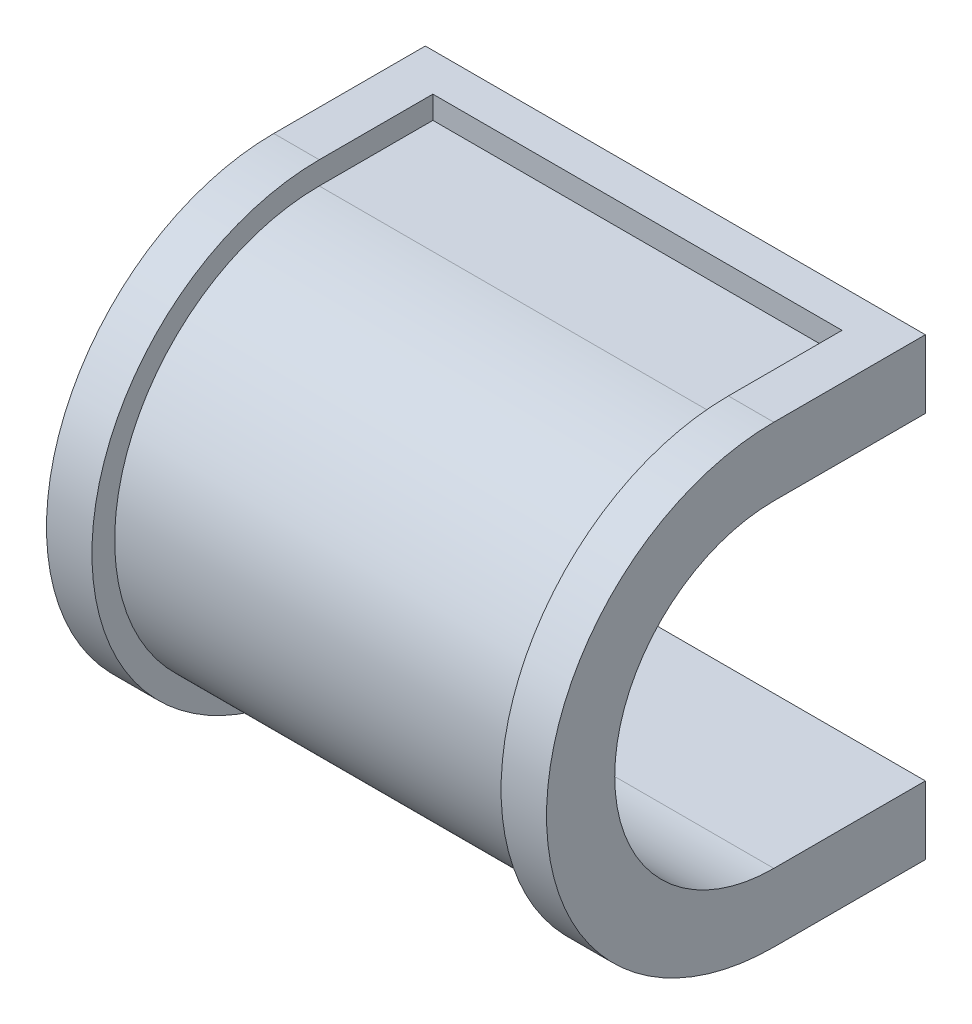
ISO-10303-21;
HEADER;
FILE_DESCRIPTION(('STEP AP214'),'2;1');
FILE_NAME('part.step','',(''),(''),'','','');
FILE_SCHEMA(('AUTOMOTIVE_DESIGN { 1 0 10303 214 1 1 1 1 }'));
ENDSEC;
DATA;
#1=APPLICATION_CONTEXT('core data for automotive mechanical design processes');
#2=APPLICATION_PROTOCOL_DEFINITION('international standard','automotive_design',2000,#1);
#3=PRODUCT_CONTEXT('',#1,'mechanical');
#4=PRODUCT('Part','Part','',(#3));
#5=PRODUCT_RELATED_PRODUCT_CATEGORY('part','',(#4));
#6=PRODUCT_DEFINITION_FORMATION('','',#4);
#7=PRODUCT_DEFINITION_CONTEXT('part definition',#1,'design');
#8=PRODUCT_DEFINITION('design','',#6,#7);
#9=PRODUCT_DEFINITION_SHAPE('','',#8);
#10=(LENGTH_UNIT() NAMED_UNIT(*) SI_UNIT(.MILLI.,.METRE.));
#11=(NAMED_UNIT(*) PLANE_ANGLE_UNIT() SI_UNIT($,.RADIAN.));
#12=(NAMED_UNIT(*) SI_UNIT($,.STERADIAN.) SOLID_ANGLE_UNIT());
#13=UNCERTAINTY_MEASURE_WITH_UNIT(LENGTH_MEASURE(1.E-05),#10,'distance_accuracy_value','');
#14=(GEOMETRIC_REPRESENTATION_CONTEXT(3) GLOBAL_UNCERTAINTY_ASSIGNED_CONTEXT((#13)) GLOBAL_UNIT_ASSIGNED_CONTEXT((#10,
#11,#12)) REPRESENTATION_CONTEXT('',''));
#15=CARTESIAN_POINT('',(0.,0.,0.));
#16=DIRECTION('',(0.,0.,1.));
#17=DIRECTION('',(1.,0.,0.));
#18=AXIS2_PLACEMENT_3D('',#15,#16,#17);
#19=CARTESIAN_POINT('',(66.,54.,-20.));
#20=DIRECTION('',(0.,0.,1.));
#21=DIRECTION('',(1.,0.,0.));
#22=AXIS2_PLACEMENT_3D('',#19,#20,#21);
#23=PLANE('',#22);
#24=DIRECTION('',(0.,1.,0.));
#25=VECTOR('',#24,1.);
#26=CARTESIAN_POINT('',(0.,54.,-20.));
#27=LINE('',#26,#25);
#28=CARTESIAN_POINT('',(0.,-3.,-20.));
#29=VERTEX_POINT('',#28);
#30=CARTESIAN_POINT('',(0.,6.,-20.));
#31=VERTEX_POINT('',#30);
#32=EDGE_CURVE('E304',#29,#31,#27,.T.);
#33=ORIENTED_EDGE('',*,*,#32,.T.);
#34=DIRECTION('',(1.,0.,0.));
#35=VECTOR('',#34,1.);
#36=CARTESIAN_POINT('',(0.,6.,-20.));
#37=LINE('',#36,#35);
#38=CARTESIAN_POINT('',(66.,6.,-20.));
#39=VERTEX_POINT('',#38);
#40=EDGE_CURVE('E275',#31,#39,#37,.T.);
#41=ORIENTED_EDGE('',*,*,#40,.T.);
#42=DIRECTION('',(0.,1.,0.));
#43=VECTOR('',#42,1.);
#44=CARTESIAN_POINT('',(66.,0.,-20.));
#45=LINE('',#44,#43);
#46=CARTESIAN_POINT('',(66.,-3.,-20.));
#47=VERTEX_POINT('',#46);
#48=EDGE_CURVE('E293',#47,#39,#45,.T.);
#49=ORIENTED_EDGE('',*,*,#48,.F.);
#50=DIRECTION('',(-1.,0.,0.));
#51=VECTOR('',#50,1.);
#52=CARTESIAN_POINT('',(66.,-3.,-20.));
#53=LINE('',#52,#51);
#54=EDGE_CURVE('E323',#47,#29,#53,.T.);
#55=ORIENTED_EDGE('',*,*,#54,.T.);
#56=EDGE_LOOP('',(#33,#41,#49,#55));
#57=FACE_BOUND('',#56,.T.);
#58=ADVANCED_FACE('F45',(#57),#23,.F.);
#59=CARTESIAN_POINT('',(66.,27.,0.));
#60=DIRECTION('',(-1.,0.,0.));
#61=DIRECTION('',(0.,0.,1.));
#62=AXIS2_PLACEMENT_3D('',#59,#60,#61);
#63=CYLINDRICAL_SURFACE('',#62,27.);
#64=DIRECTION('',(-1.,0.,0.));
#65=VECTOR('',#64,1.);
#66=CARTESIAN_POINT('',(66.,54.,0.));
#67=LINE('',#66,#65);
#68=CARTESIAN_POINT('',(60.,54.,0.));
#69=VERTEX_POINT('',#68);
#70=CARTESIAN_POINT('',(6.,54.,0.));
#71=VERTEX_POINT('',#70);
#72=EDGE_CURVE('E300',#69,#71,#67,.T.);
#73=ORIENTED_EDGE('',*,*,#72,.T.);
#74=CARTESIAN_POINT('',(6.,27.,0.));
#75=DIRECTION('',(1.,0.,0.));
#76=DIRECTION('',(0.,0.,-1.));
#77=AXIS2_PLACEMENT_3D('',#74,#75,#76);
#78=CIRCLE('',#77,27.);
#79=CARTESIAN_POINT('',(6.,0.,0.));
#80=VERTEX_POINT('',#79);
#81=EDGE_CURVE('E61',#71,#80,#78,.T.);
#82=ORIENTED_EDGE('',*,*,#81,.T.);
#83=DIRECTION('',(-1.,0.,0.));
#84=VECTOR('',#83,1.);
#85=CARTESIAN_POINT('',(66.,0.,0.));
#86=LINE('',#85,#84);
#87=CARTESIAN_POINT('',(60.,0.,0.));
#88=VERTEX_POINT('',#87);
#89=EDGE_CURVE('E11',#88,#80,#86,.T.);
#90=ORIENTED_EDGE('',*,*,#89,.F.);
#91=CARTESIAN_POINT('',(60.,27.,0.));
#92=DIRECTION('',(-1.,0.,0.));
#93=DIRECTION('',(0.,0.,1.));
#94=AXIS2_PLACEMENT_3D('',#91,#92,#93);
#95=CIRCLE('',#94,27.);
#96=EDGE_CURVE('E213',#88,#69,#95,.T.);
#97=ORIENTED_EDGE('',*,*,#96,.T.);
#98=EDGE_LOOP('',(#73,#82,#90,#97));
#99=FACE_BOUND('',#98,.T.);
#100=ADVANCED_FACE('F47',(#99),#63,.T.);
#101=CARTESIAN_POINT('',(66.,0.,0.));
#102=DIRECTION('',(0.,1.,0.));
#103=DIRECTION('',(0.,0.,1.));
#104=AXIS2_PLACEMENT_3D('',#101,#102,#103);
#105=PLANE('',#104);
#106=ORIENTED_EDGE('',*,*,#89,.T.);
#107=DIRECTION('',(0.,0.,-1.));
#108=VECTOR('',#107,1.);
#109=CARTESIAN_POINT('',(6.,0.,0.));
#110=LINE('',#109,#108);
#111=CARTESIAN_POINT('',(6.,0.,-15.));
#112=VERTEX_POINT('',#111);
#113=EDGE_CURVE('E67',#80,#112,#110,.T.);
#114=ORIENTED_EDGE('',*,*,#113,.T.);
#115=DIRECTION('',(-1.,0.,0.));
#116=VECTOR('',#115,1.);
#117=CARTESIAN_POINT('',(66.,0.,-15.));
#118=LINE('',#117,#116);
#119=CARTESIAN_POINT('',(60.,0.,-15.));
#120=VERTEX_POINT('',#119);
#121=EDGE_CURVE('E54',#120,#112,#118,.T.);
#122=ORIENTED_EDGE('',*,*,#121,.F.);
#123=DIRECTION('',(0.,0.,1.));
#124=VECTOR('',#123,1.);
#125=CARTESIAN_POINT('',(60.,0.,-15.));
#126=LINE('',#125,#124);
#127=EDGE_CURVE('E209',#120,#88,#126,.T.);
#128=ORIENTED_EDGE('',*,*,#127,.T.);
#129=EDGE_LOOP('',(#106,#114,#122,#128));
#130=FACE_BOUND('',#129,.T.);
#131=ADVANCED_FACE('F343',(#130),#105,.F.);
#132=CARTESIAN_POINT('',(66.,-3.,-15.));
#133=DIRECTION('',(0.,0.,-1.));
#134=DIRECTION('',(-1.,0.,0.));
#135=AXIS2_PLACEMENT_3D('',#132,#133,#134);
#136=PLANE('',#135);
#137=ORIENTED_EDGE('',*,*,#121,.T.);
#138=DIRECTION('',(0.,-1.,0.));
#139=VECTOR('',#138,1.);
#140=CARTESIAN_POINT('',(6.,0.,-15.));
#141=LINE('',#140,#139);
#142=CARTESIAN_POINT('',(6.,-3.,-15.));
#143=VERTEX_POINT('',#142);
#144=EDGE_CURVE('E193',#112,#143,#141,.T.);
#145=ORIENTED_EDGE('',*,*,#144,.T.);
#146=DIRECTION('',(-1.,0.,0.));
#147=VECTOR('',#146,1.);
#148=CARTESIAN_POINT('',(66.,-3.,-15.));
#149=LINE('',#148,#147);
#150=CARTESIAN_POINT('',(60.,-3.,-15.));
#151=VERTEX_POINT('',#150);
#152=EDGE_CURVE('E191',#151,#143,#149,.T.);
#153=ORIENTED_EDGE('',*,*,#152,.F.);
#154=DIRECTION('',(0.,1.,0.));
#155=VECTOR('',#154,1.);
#156=CARTESIAN_POINT('',(60.,-3.,-15.));
#157=LINE('',#156,#155);
#158=EDGE_CURVE('E236',#151,#120,#157,.T.);
#159=ORIENTED_EDGE('',*,*,#158,.T.);
#160=EDGE_LOOP('',(#137,#145,#153,#159));
#161=FACE_BOUND('',#160,.T.);
#162=ADVANCED_FACE('F330',(#161),#136,.F.);
#163=CARTESIAN_POINT('',(66.,-3.,-20.));
#164=DIRECTION('',(0.,1.,0.));
#165=DIRECTION('',(0.,0.,1.));
#166=AXIS2_PLACEMENT_3D('',#163,#164,#165);
#167=PLANE('',#166);
#168=DIRECTION('',(0.,0.,-1.));
#169=VECTOR('',#168,1.);
#170=CARTESIAN_POINT('',(0.,-3.,-20.));
#171=LINE('',#170,#169);
#172=CARTESIAN_POINT('',(0.,-3.,0.));
#173=VERTEX_POINT('',#172);
#174=EDGE_CURVE('E279',#173,#29,#171,.T.);
#175=ORIENTED_EDGE('',*,*,#174,.T.);
#176=ORIENTED_EDGE('',*,*,#54,.F.);
#177=DIRECTION('',(0.,0.,-1.));
#178=VECTOR('',#177,1.);
#179=CARTESIAN_POINT('',(66.,-3.,-20.));
#180=LINE('',#179,#178);
#181=CARTESIAN_POINT('',(66.,-3.,0.));
#182=VERTEX_POINT('',#181);
#183=EDGE_CURVE('E288',#182,#47,#180,.T.);
#184=ORIENTED_EDGE('',*,*,#183,.F.);
#185=DIRECTION('',(1.,0.,0.));
#186=VECTOR('',#185,1.);
#187=CARTESIAN_POINT('',(60.,-3.,0.));
#188=LINE('',#187,#186);
#189=CARTESIAN_POINT('',(60.,-3.,0.));
#190=VERTEX_POINT('',#189);
#191=EDGE_CURVE('E244',#190,#182,#188,.T.);
#192=ORIENTED_EDGE('',*,*,#191,.F.);
#193=DIRECTION('',(0.,0.,-1.));
#194=VECTOR('',#193,1.);
#195=CARTESIAN_POINT('',(60.,-3.,0.));
#196=LINE('',#195,#194);
#197=EDGE_CURVE('E233',#190,#151,#196,.T.);
#198=ORIENTED_EDGE('',*,*,#197,.T.);
#199=ORIENTED_EDGE('',*,*,#152,.T.);
#200=DIRECTION('',(0.,0.,1.));
#201=VECTOR('',#200,1.);
#202=CARTESIAN_POINT('',(6.,-3.,-15.));
#203=LINE('',#202,#201);
#204=CARTESIAN_POINT('',(6.,-3.,0.));
#205=VERTEX_POINT('',#204);
#206=EDGE_CURVE('E182',#143,#205,#203,.T.);
#207=ORIENTED_EDGE('',*,*,#206,.T.);
#208=DIRECTION('',(-1.,0.,0.));
#209=VECTOR('',#208,1.);
#210=CARTESIAN_POINT('',(6.,-3.,0.));
#211=LINE('',#210,#209);
#212=EDGE_CURVE('E162',#205,#173,#211,.T.);
#213=ORIENTED_EDGE('',*,*,#212,.T.);
#214=EDGE_LOOP('',(#175,#176,#184,#192,#198,#199,#207,#213));
#215=FACE_BOUND('',#214,.T.);
#216=ADVANCED_FACE('F189',(#215),#167,.F.);
#217=CARTESIAN_POINT('',(66.,48.,-20.));
#218=VERTEX_POINT('',#217);
#219=CARTESIAN_POINT('',(66.,57.,-20.));
#220=VERTEX_POINT('',#219);
#221=EDGE_CURVE('E291',#218,#220,#45,.T.);
#222=ORIENTED_EDGE('',*,*,#221,.F.);
#223=DIRECTION('',(1.,0.,0.));
#224=VECTOR('',#223,1.);
#225=CARTESIAN_POINT('',(0.,48.,-20.));
#226=LINE('',#225,#224);
#227=CARTESIAN_POINT('',(0.,48.,-20.));
#228=VERTEX_POINT('',#227);
#229=EDGE_CURVE('E265',#228,#218,#226,.T.);
#230=ORIENTED_EDGE('',*,*,#229,.F.);
#231=CARTESIAN_POINT('',(0.,57.,-20.));
#232=VERTEX_POINT('',#231);
#233=EDGE_CURVE('E303',#228,#232,#27,.T.);
#234=ORIENTED_EDGE('',*,*,#233,.T.);
#235=DIRECTION('',(-1.,0.,0.));
#236=VECTOR('',#235,1.);
#237=CARTESIAN_POINT('',(66.,57.,-20.));
#238=LINE('',#237,#236);
#239=EDGE_CURVE('E319',#220,#232,#238,.T.);
#240=ORIENTED_EDGE('',*,*,#239,.F.);
#241=EDGE_LOOP('',(#222,#230,#234,#240));
#242=FACE_BOUND('',#241,.T.);
#243=ADVANCED_FACE('F353',(#242),#23,.F.);
#244=CARTESIAN_POINT('',(66.,57.,-20.));
#245=DIRECTION('',(0.,-1.,0.));
#246=DIRECTION('',(0.,0.,-1.));
#247=AXIS2_PLACEMENT_3D('',#244,#245,#246);
#248=PLANE('',#247);
#249=DIRECTION('',(0.,0.,1.));
#250=VECTOR('',#249,1.);
#251=CARTESIAN_POINT('',(0.,57.,-20.));
#252=LINE('',#251,#250);
#253=CARTESIAN_POINT('',(0.,57.,0.));
#254=VERTEX_POINT('',#253);
#255=EDGE_CURVE('E292',#232,#254,#252,.T.);
#256=ORIENTED_EDGE('',*,*,#255,.T.);
#257=DIRECTION('',(-1.,0.,0.));
#258=VECTOR('',#257,1.);
#259=CARTESIAN_POINT('',(6.,57.,0.));
#260=LINE('',#259,#258);
#261=CARTESIAN_POINT('',(6.,57.,0.));
#262=VERTEX_POINT('',#261);
#263=EDGE_CURVE('E173',#262,#254,#260,.T.);
#264=ORIENTED_EDGE('',*,*,#263,.F.);
#265=DIRECTION('',(0.,0.,-1.));
#266=VECTOR('',#265,1.);
#267=CARTESIAN_POINT('',(6.,57.,-15.));
#268=LINE('',#267,#266);
#269=CARTESIAN_POINT('',(6.,57.,-15.));
#270=VERTEX_POINT('',#269);
#271=EDGE_CURVE('E185',#262,#270,#268,.T.);
#272=ORIENTED_EDGE('',*,*,#271,.T.);
#273=DIRECTION('',(-1.,0.,0.));
#274=VECTOR('',#273,1.);
#275=CARTESIAN_POINT('',(66.,57.,-15.));
#276=LINE('',#275,#274);
#277=CARTESIAN_POINT('',(60.,57.,-15.));
#278=VERTEX_POINT('',#277);
#279=EDGE_CURVE('E316',#278,#270,#276,.T.);
#280=ORIENTED_EDGE('',*,*,#279,.F.);
#281=DIRECTION('',(0.,0.,1.));
#282=VECTOR('',#281,1.);
#283=CARTESIAN_POINT('',(60.,57.,-15.));
#284=LINE('',#283,#282);
#285=CARTESIAN_POINT('',(60.,57.,0.));
#286=VERTEX_POINT('',#285);
#287=EDGE_CURVE('E225',#278,#286,#284,.T.);
#288=ORIENTED_EDGE('',*,*,#287,.T.);
#289=DIRECTION('',(1.,0.,0.));
#290=VECTOR('',#289,1.);
#291=CARTESIAN_POINT('',(60.,57.,0.));
#292=LINE('',#291,#290);
#293=CARTESIAN_POINT('',(66.,57.,0.));
#294=VERTEX_POINT('',#293);
#295=EDGE_CURVE('E240',#286,#294,#292,.T.);
#296=ORIENTED_EDGE('',*,*,#295,.T.);
#297=DIRECTION('',(0.,0.,1.));
#298=VECTOR('',#297,1.);
#299=CARTESIAN_POINT('',(66.,57.,-20.));
#300=LINE('',#299,#298);
#301=EDGE_CURVE('E297',#220,#294,#300,.T.);
#302=ORIENTED_EDGE('',*,*,#301,.F.);
#303=ORIENTED_EDGE('',*,*,#239,.T.);
#304=EDGE_LOOP('',(#256,#264,#272,#280,#288,#296,#302,#303));
#305=FACE_BOUND('',#304,.T.);
#306=ADVANCED_FACE('F359',(#305),#248,.F.);
#307=CARTESIAN_POINT('',(66.,57.,-15.));
#308=DIRECTION('',(0.,0.,-1.));
#309=DIRECTION('',(-1.,0.,0.));
#310=AXIS2_PLACEMENT_3D('',#307,#308,#309);
#311=PLANE('',#310);
#312=ORIENTED_EDGE('',*,*,#279,.T.);
#313=DIRECTION('',(0.,-1.,0.));
#314=VECTOR('',#313,1.);
#315=CARTESIAN_POINT('',(6.,54.,-15.));
#316=LINE('',#315,#314);
#317=CARTESIAN_POINT('',(6.,54.,-15.));
#318=VERTEX_POINT('',#317);
#319=EDGE_CURVE('E174',#270,#318,#316,.T.);
#320=ORIENTED_EDGE('',*,*,#319,.T.);
#321=DIRECTION('',(-1.,0.,0.));
#322=VECTOR('',#321,1.);
#323=CARTESIAN_POINT('',(66.,54.,-15.));
#324=LINE('',#323,#322);
#325=CARTESIAN_POINT('',(60.,54.,-15.));
#326=VERTEX_POINT('',#325);
#327=EDGE_CURVE('E312',#326,#318,#324,.T.);
#328=ORIENTED_EDGE('',*,*,#327,.F.);
#329=DIRECTION('',(0.,1.,0.));
#330=VECTOR('',#329,1.);
#331=CARTESIAN_POINT('',(60.,57.,-15.));
#332=LINE('',#331,#330);
#333=EDGE_CURVE('E221',#326,#278,#332,.T.);
#334=ORIENTED_EDGE('',*,*,#333,.T.);
#335=EDGE_LOOP('',(#312,#320,#328,#334));
#336=FACE_BOUND('',#335,.T.);
#337=ADVANCED_FACE('F365',(#336),#311,.F.);
#338=CARTESIAN_POINT('',(66.,54.,-15.));
#339=DIRECTION('',(0.,-1.,0.));
#340=DIRECTION('',(0.,0.,-1.));
#341=AXIS2_PLACEMENT_3D('',#338,#339,#340);
#342=PLANE('',#341);
#343=ORIENTED_EDGE('',*,*,#327,.T.);
#344=DIRECTION('',(0.,0.,1.));
#345=VECTOR('',#344,1.);
#346=CARTESIAN_POINT('',(6.,54.,-15.));
#347=LINE('',#346,#345);
#348=EDGE_CURVE('E205',#318,#71,#347,.T.);
#349=ORIENTED_EDGE('',*,*,#348,.T.);
#350=ORIENTED_EDGE('',*,*,#72,.F.);
#351=DIRECTION('',(0.,0.,-1.));
#352=VECTOR('',#351,1.);
#353=CARTESIAN_POINT('',(60.,54.,-15.));
#354=LINE('',#353,#352);
#355=EDGE_CURVE('E217',#69,#326,#354,.T.);
#356=ORIENTED_EDGE('',*,*,#355,.T.);
#357=EDGE_LOOP('',(#343,#349,#350,#356));
#358=FACE_BOUND('',#357,.T.);
#359=ADVANCED_FACE('F339',(#358),#342,.F.);
#360=CARTESIAN_POINT('',(66.,27.,0.));
#361=DIRECTION('',(-1.,0.,0.));
#362=DIRECTION('',(0.,0.,1.));
#363=AXIS2_PLACEMENT_3D('',#360,#361,#362);
#364=PLANE('',#363);
#365=CARTESIAN_POINT('',(66.,27.,0.));
#366=DIRECTION('',(1.,0.,0.));
#367=DIRECTION('',(0.,0.,-1.));
#368=AXIS2_PLACEMENT_3D('',#365,#366,#367);
#369=CIRCLE('',#368,30.);
#370=EDGE_CURVE('E207',#294,#182,#369,.T.);
#371=ORIENTED_EDGE('',*,*,#370,.T.);
#372=ORIENTED_EDGE('',*,*,#183,.T.);
#373=ORIENTED_EDGE('',*,*,#48,.T.);
#374=DIRECTION('',(0.,0.,-1.));
#375=VECTOR('',#374,1.);
#376=CARTESIAN_POINT('',(66.,6.,0.));
#377=LINE('',#376,#375);
#378=CARTESIAN_POINT('',(66.,6.,0.));
#379=VERTEX_POINT('',#378);
#380=EDGE_CURVE('E257',#379,#39,#377,.T.);
#381=ORIENTED_EDGE('',*,*,#380,.F.);
#382=CARTESIAN_POINT('',(66.,27.,0.));
#383=DIRECTION('',(1.,0.,0.));
#384=DIRECTION('',(0.,0.,-1.));
#385=AXIS2_PLACEMENT_3D('',#382,#383,#384);
#386=CIRCLE('',#385,21.);
#387=CARTESIAN_POINT('',(66.,48.,0.));
#388=VERTEX_POINT('',#387);
#389=EDGE_CURVE('E269',#388,#379,#386,.T.);
#390=ORIENTED_EDGE('',*,*,#389,.F.);
#391=DIRECTION('',(0.,0.,1.));
#392=VECTOR('',#391,1.);
#393=CARTESIAN_POINT('',(66.,48.,0.));
#394=LINE('',#393,#392);
#395=EDGE_CURVE('E248',#218,#388,#394,.T.);
#396=ORIENTED_EDGE('',*,*,#395,.F.);
#397=ORIENTED_EDGE('',*,*,#221,.T.);
#398=ORIENTED_EDGE('',*,*,#301,.T.);
#399=EDGE_LOOP('',(#371,#372,#373,#381,#390,#396,#397,#398));
#400=FACE_BOUND('',#399,.T.);
#401=ADVANCED_FACE('F383',(#400),#364,.F.);
#402=CARTESIAN_POINT('',(0.,27.,0.));
#403=DIRECTION('',(-1.,0.,0.));
#404=DIRECTION('',(0.,0.,1.));
#405=AXIS2_PLACEMENT_3D('',#402,#403,#404);
#406=PLANE('',#405);
#407=ORIENTED_EDGE('',*,*,#174,.F.);
#408=CARTESIAN_POINT('',(0.,27.,0.));
#409=DIRECTION('',(-1.,0.,0.));
#410=DIRECTION('',(0.,0.,-1.));
#411=AXIS2_PLACEMENT_3D('',#408,#409,#410);
#412=CIRCLE('',#411,30.);
#413=EDGE_CURVE('E168',#173,#254,#412,.T.);
#414=ORIENTED_EDGE('',*,*,#413,.T.);
#415=ORIENTED_EDGE('',*,*,#255,.F.);
#416=ORIENTED_EDGE('',*,*,#233,.F.);
#417=DIRECTION('',(0.,0.,1.));
#418=VECTOR('',#417,1.);
#419=CARTESIAN_POINT('',(0.,48.,0.));
#420=LINE('',#419,#418);
#421=CARTESIAN_POINT('',(0.,48.,0.));
#422=VERTEX_POINT('',#421);
#423=EDGE_CURVE('E252',#228,#422,#420,.T.);
#424=ORIENTED_EDGE('',*,*,#423,.T.);
#425=CARTESIAN_POINT('',(0.,27.,0.));
#426=DIRECTION('',(1.,0.,0.));
#427=DIRECTION('',(0.,0.,-1.));
#428=AXIS2_PLACEMENT_3D('',#425,#426,#427);
#429=CIRCLE('',#428,21.);
#430=CARTESIAN_POINT('',(0.,6.,0.));
#431=VERTEX_POINT('',#430);
#432=EDGE_CURVE('E256',#422,#431,#429,.T.);
#433=ORIENTED_EDGE('',*,*,#432,.T.);
#434=DIRECTION('',(0.,0.,-1.));
#435=VECTOR('',#434,1.);
#436=CARTESIAN_POINT('',(0.,6.,0.));
#437=LINE('',#436,#435);
#438=EDGE_CURVE('E261',#431,#31,#437,.T.);
#439=ORIENTED_EDGE('',*,*,#438,.T.);
#440=ORIENTED_EDGE('',*,*,#32,.F.);
#441=EDGE_LOOP('',(#407,#414,#415,#416,#424,#433,#439,#440));
#442=FACE_BOUND('',#441,.T.);
#443=ADVANCED_FACE('F379',(#442),#406,.T.);
#444=CARTESIAN_POINT('',(0.,6.,0.));
#445=DIRECTION('',(0.,-1.,0.));
#446=DIRECTION('',(0.,0.,-1.));
#447=AXIS2_PLACEMENT_3D('',#444,#445,#446);
#448=PLANE('',#447);
#449=ORIENTED_EDGE('',*,*,#380,.T.);
#450=ORIENTED_EDGE('',*,*,#40,.F.);
#451=ORIENTED_EDGE('',*,*,#438,.F.);
#452=DIRECTION('',(1.,0.,0.));
#453=VECTOR('',#452,1.);
#454=CARTESIAN_POINT('',(0.,6.,0.));
#455=LINE('',#454,#453);
#456=EDGE_CURVE('E280',#431,#379,#455,.T.);
#457=ORIENTED_EDGE('',*,*,#456,.T.);
#458=EDGE_LOOP('',(#449,#450,#451,#457));
#459=FACE_BOUND('',#458,.T.);
#460=ADVANCED_FACE('F401',(#459),#448,.F.);
#461=CARTESIAN_POINT('',(0.,27.,0.));
#462=DIRECTION('',(1.,0.,0.));
#463=DIRECTION('',(0.,0.,-1.));
#464=AXIS2_PLACEMENT_3D('',#461,#462,#463);
#465=CYLINDRICAL_SURFACE('',#464,21.);
#466=ORIENTED_EDGE('',*,*,#389,.T.);
#467=ORIENTED_EDGE('',*,*,#456,.F.);
#468=ORIENTED_EDGE('',*,*,#432,.F.);
#469=DIRECTION('',(1.,0.,0.));
#470=VECTOR('',#469,1.);
#471=CARTESIAN_POINT('',(0.,48.,0.));
#472=LINE('',#471,#470);
#473=EDGE_CURVE('E283',#422,#388,#472,.T.);
#474=ORIENTED_EDGE('',*,*,#473,.T.);
#475=EDGE_LOOP('',(#466,#467,#468,#474));
#476=FACE_BOUND('',#475,.T.);
#477=ADVANCED_FACE('F407',(#476),#465,.F.);
#478=CARTESIAN_POINT('',(0.,48.,0.));
#479=DIRECTION('',(0.,1.,0.));
#480=DIRECTION('',(0.,0.,1.));
#481=AXIS2_PLACEMENT_3D('',#478,#479,#480);
#482=PLANE('',#481);
#483=ORIENTED_EDGE('',*,*,#395,.T.);
#484=ORIENTED_EDGE('',*,*,#473,.F.);
#485=ORIENTED_EDGE('',*,*,#423,.F.);
#486=ORIENTED_EDGE('',*,*,#229,.T.);
#487=EDGE_LOOP('',(#483,#484,#485,#486));
#488=FACE_BOUND('',#487,.T.);
#489=ADVANCED_FACE('F404',(#488),#482,.F.);
#490=CARTESIAN_POINT('',(60.,27.,0.));
#491=DIRECTION('',(1.,0.,0.));
#492=DIRECTION('',(0.,0.,-1.));
#493=AXIS2_PLACEMENT_3D('',#490,#491,#492);
#494=CYLINDRICAL_SURFACE('',#493,30.);
#495=ORIENTED_EDGE('',*,*,#370,.F.);
#496=ORIENTED_EDGE('',*,*,#295,.F.);
#497=CARTESIAN_POINT('',(60.,27.,0.));
#498=DIRECTION('',(1.,0.,0.));
#499=DIRECTION('',(0.,0.,-1.));
#500=AXIS2_PLACEMENT_3D('',#497,#498,#499);
#501=CIRCLE('',#500,30.);
#502=EDGE_CURVE('E229',#286,#190,#501,.T.);
#503=ORIENTED_EDGE('',*,*,#502,.T.);
#504=ORIENTED_EDGE('',*,*,#191,.T.);
#505=EDGE_LOOP('',(#495,#496,#503,#504));
#506=FACE_BOUND('',#505,.T.);
#507=ADVANCED_FACE('F388',(#506),#494,.T.);
#508=CARTESIAN_POINT('',(60.,27.,0.));
#509=DIRECTION('',(-1.,0.,0.));
#510=DIRECTION('',(0.,0.,1.));
#511=AXIS2_PLACEMENT_3D('',#508,#509,#510);
#512=PLANE('',#511);
#513=ORIENTED_EDGE('',*,*,#127,.F.);
#514=ORIENTED_EDGE('',*,*,#158,.F.);
#515=ORIENTED_EDGE('',*,*,#197,.F.);
#516=ORIENTED_EDGE('',*,*,#502,.F.);
#517=ORIENTED_EDGE('',*,*,#287,.F.);
#518=ORIENTED_EDGE('',*,*,#333,.F.);
#519=ORIENTED_EDGE('',*,*,#355,.F.);
#520=ORIENTED_EDGE('',*,*,#96,.F.);
#521=EDGE_LOOP('',(#513,#514,#515,#516,#517,#518,#519,#520));
#522=FACE_BOUND('',#521,.T.);
#523=ADVANCED_FACE('F342',(#522),#512,.T.);
#524=CARTESIAN_POINT('',(6.,27.,0.));
#525=DIRECTION('',(-1.,0.,0.));
#526=DIRECTION('',(0.,0.,1.));
#527=AXIS2_PLACEMENT_3D('',#524,#525,#526);
#528=CYLINDRICAL_SURFACE('',#527,30.);
#529=ORIENTED_EDGE('',*,*,#413,.F.);
#530=ORIENTED_EDGE('',*,*,#212,.F.);
#531=CARTESIAN_POINT('',(6.,27.,0.));
#532=DIRECTION('',(-1.,0.,0.));
#533=DIRECTION('',(0.,0.,-1.));
#534=AXIS2_PLACEMENT_3D('',#531,#532,#533);
#535=CIRCLE('',#534,30.);
#536=EDGE_CURVE('E166',#205,#262,#535,.T.);
#537=ORIENTED_EDGE('',*,*,#536,.T.);
#538=ORIENTED_EDGE('',*,*,#263,.T.);
#539=EDGE_LOOP('',(#529,#530,#537,#538));
#540=FACE_BOUND('',#539,.T.);
#541=ADVANCED_FACE('F164',(#540),#528,.T.);
#542=CARTESIAN_POINT('',(6.,27.,0.));
#543=DIRECTION('',(1.,0.,0.));
#544=DIRECTION('',(0.,0.,-1.));
#545=AXIS2_PLACEMENT_3D('',#542,#543,#544);
#546=PLANE('',#545);
#547=ORIENTED_EDGE('',*,*,#348,.F.);
#548=ORIENTED_EDGE('',*,*,#319,.F.);
#549=ORIENTED_EDGE('',*,*,#271,.F.);
#550=ORIENTED_EDGE('',*,*,#536,.F.);
#551=ORIENTED_EDGE('',*,*,#206,.F.);
#552=ORIENTED_EDGE('',*,*,#144,.F.);
#553=ORIENTED_EDGE('',*,*,#113,.F.);
#554=ORIENTED_EDGE('',*,*,#81,.F.);
#555=EDGE_LOOP('',(#547,#548,#549,#550,#551,#552,#553,#554));
#556=FACE_BOUND('',#555,.T.);
#557=ADVANCED_FACE('F180',(#556),#546,.T.);
#558=CLOSED_SHELL('',(#58,#100,#131,#162,#216,#243,#306,#337,#359,#401,#443,#460,#477,#489,#507,
#523,#541,#557));
#559=MANIFOLD_SOLID_BREP('B2',#558);
#560=ADVANCED_BREP_SHAPE_REPRESENTATION('',(#18,#559),#14);
#561=SHAPE_DEFINITION_REPRESENTATION(#9,#560);
ENDSEC;
END-ISO-10303-21;
